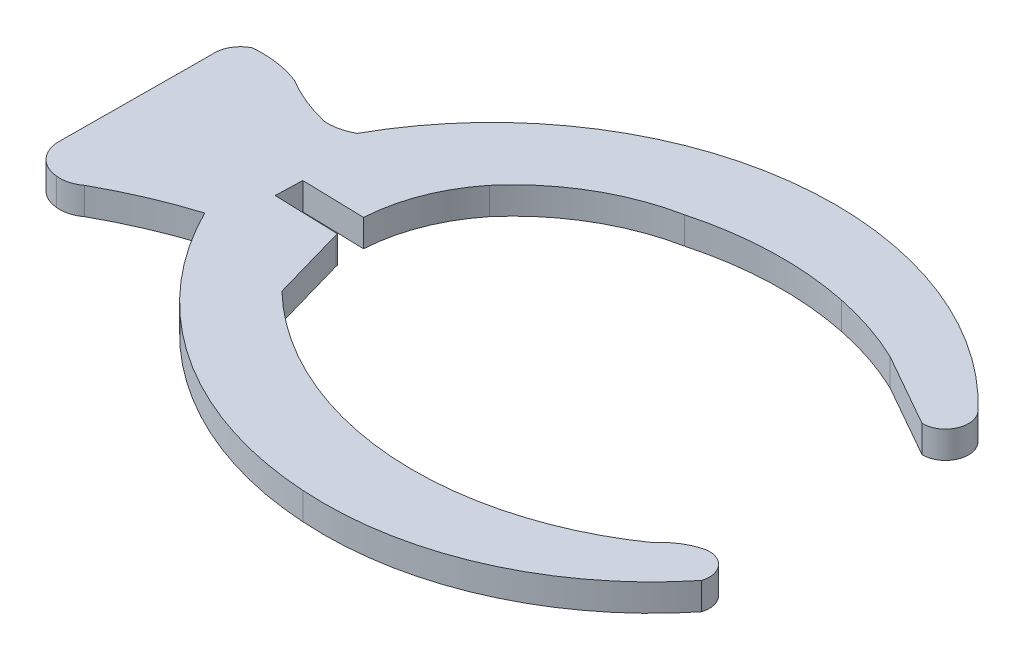
ISO-10303-21;
HEADER;
FILE_DESCRIPTION(('STEP AP214'),'2;1');
FILE_NAME('part.step','',(''),(''),'','','');
FILE_SCHEMA(('AUTOMOTIVE_DESIGN { 1 0 10303 214 1 1 1 1 }'));
ENDSEC;
DATA;
#1=APPLICATION_CONTEXT('core data for automotive mechanical design processes');
#2=APPLICATION_PROTOCOL_DEFINITION('international standard','automotive_design',2000,#1);
#3=PRODUCT_CONTEXT('',#1,'mechanical');
#4=PRODUCT('Part','Part','',(#3));
#5=PRODUCT_RELATED_PRODUCT_CATEGORY('part','',(#4));
#6=PRODUCT_DEFINITION_FORMATION('','',#4);
#7=PRODUCT_DEFINITION_CONTEXT('part definition',#1,'design');
#8=PRODUCT_DEFINITION('design','',#6,#7);
#9=PRODUCT_DEFINITION_SHAPE('','',#8);
#10=(LENGTH_UNIT() NAMED_UNIT(*) SI_UNIT(.MILLI.,.METRE.));
#11=(NAMED_UNIT(*) PLANE_ANGLE_UNIT() SI_UNIT($,.RADIAN.));
#12=(NAMED_UNIT(*) SI_UNIT($,.STERADIAN.) SOLID_ANGLE_UNIT());
#13=UNCERTAINTY_MEASURE_WITH_UNIT(LENGTH_MEASURE(1.E-05),#10,'distance_accuracy_value','');
#14=(GEOMETRIC_REPRESENTATION_CONTEXT(3) GLOBAL_UNCERTAINTY_ASSIGNED_CONTEXT((#13)) GLOBAL_UNIT_ASSIGNED_CONTEXT((#10,
#11,#12)) REPRESENTATION_CONTEXT('',''));
#15=CARTESIAN_POINT('',(0.,0.,0.));
#16=DIRECTION('',(0.,0.,1.));
#17=DIRECTION('',(1.,0.,0.));
#18=AXIS2_PLACEMENT_3D('',#15,#16,#17);
#19=CARTESIAN_POINT('',(93.208500000004,3.,82.9887600000175));
#20=DIRECTION('',(-0.998722727054454,0.,0.0505263739537519));
#21=DIRECTION('',(0.0505263739537519,0.,0.998722727054454));
#22=AXIS2_PLACEMENT_3D('',#19,#20,#21);
#23=PLANE('',#22);
#24=DIRECTION('',(-0.0505263739537519,0.,-0.998722727054454));
#25=VECTOR('',#24,1.);
#26=CARTESIAN_POINT('',(93.208500000004,0.,82.9887600000175));
#27=LINE('',#26,#25);
#28=CARTESIAN_POINT('',(93.208500000004,0.,82.9887600000175));
#29=VERTEX_POINT('',#28);
#30=CARTESIAN_POINT('',(93.198570000004,0.,82.7924800000175));
#31=VERTEX_POINT('',#30);
#32=EDGE_CURVE('E245',#29,#31,#27,.T.);
#33=ORIENTED_EDGE('',*,*,#32,.T.);
#34=DIRECTION('',(0.,-1.,0.));
#35=VECTOR('',#34,1.);
#36=CARTESIAN_POINT('',(93.198570000004,3.,82.7924800000175));
#37=LINE('',#36,#35);
#38=CARTESIAN_POINT('',(93.198570000004,3.,82.7924800000175));
#39=VERTEX_POINT('',#38);
#40=EDGE_CURVE('E11',#39,#31,#37,.T.);
#41=ORIENTED_EDGE('',*,*,#40,.F.);
#42=DIRECTION('',(-0.0505263739537519,0.,-0.998722727054454));
#43=VECTOR('',#42,1.);
#44=CARTESIAN_POINT('',(93.208500000004,3.,82.9887600000175));
#45=LINE('',#44,#43);
#46=CARTESIAN_POINT('',(93.208500000004,3.,82.9887600000175));
#47=VERTEX_POINT('',#46);
#48=EDGE_CURVE('E297',#47,#39,#45,.T.);
#49=ORIENTED_EDGE('',*,*,#48,.F.);
#50=DIRECTION('',(0.,-1.,0.));
#51=VECTOR('',#50,1.);
#52=CARTESIAN_POINT('',(93.208500000004,3.,82.9887600000175));
#53=LINE('',#52,#51);
#54=EDGE_CURVE('E241',#47,#29,#53,.T.);
#55=ORIENTED_EDGE('',*,*,#54,.T.);
#56=EDGE_LOOP('',(#33,#41,#49,#55));
#57=FACE_BOUND('',#56,.T.);
#58=ADVANCED_FACE('F35',(#57),#23,.F.);
#59=CARTESIAN_POINT('',(93.198570000004,3.,82.7924800000175));
#60=DIRECTION('',(-0.0312705869783198,0.,0.999510955612809));
#61=DIRECTION('',(0.999510955612809,0.,0.0312705869783198));
#62=AXIS2_PLACEMENT_3D('',#59,#60,#61);
#63=PLANE('',#62);
#64=DIRECTION('',(-0.999510955612809,0.,-0.0312705869783198));
#65=VECTOR('',#64,1.);
#66=CARTESIAN_POINT('',(93.198570000004,0.,82.7924800000175));
#67=LINE('',#66,#65);
#68=CARTESIAN_POINT('',(86.075550000004,0.,82.5696300000175));
#69=VERTEX_POINT('',#68);
#70=EDGE_CURVE('E248',#31,#69,#67,.T.);
#71=ORIENTED_EDGE('',*,*,#70,.T.);
#72=DIRECTION('',(0.,-1.,0.));
#73=VECTOR('',#72,1.);
#74=CARTESIAN_POINT('',(86.075550000004,3.,82.5696300000175));
#75=LINE('',#74,#73);
#76=CARTESIAN_POINT('',(86.075550000004,3.,82.5696300000175));
#77=VERTEX_POINT('',#76);
#78=EDGE_CURVE('E43',#77,#69,#75,.T.);
#79=ORIENTED_EDGE('',*,*,#78,.F.);
#80=DIRECTION('',(-0.999510955612809,0.,-0.0312705869783198));
#81=VECTOR('',#80,1.);
#82=CARTESIAN_POINT('',(93.198570000004,3.,82.7924800000175));
#83=LINE('',#82,#81);
#84=EDGE_CURVE('E151',#39,#77,#83,.T.);
#85=ORIENTED_EDGE('',*,*,#84,.F.);
#86=ORIENTED_EDGE('',*,*,#40,.T.);
#87=EDGE_LOOP('',(#71,#79,#85,#86));
#88=FACE_BOUND('',#87,.T.);
#89=ADVANCED_FACE('F450',(#88),#63,.F.);
#90=CARTESIAN_POINT('',(86.075550000004,3.,82.5696300000175));
#91=DIRECTION('',(-0.999593210603115,0.,-0.028520401753075));
#92=DIRECTION('',(-0.028520401753075,0.,0.999593210603115));
#93=AXIS2_PLACEMENT_3D('',#90,#91,#92);
#94=PLANE('',#93);
#95=DIRECTION('',(0.028520401753075,0.,-0.999593210603115));
#96=VECTOR('',#95,1.);
#97=CARTESIAN_POINT('',(86.075550000004,0.,82.5696300000175));
#98=LINE('',#97,#96);
#99=CARTESIAN_POINT('',(86.160130000004,0.,79.6052400000175));
#100=VERTEX_POINT('',#99);
#101=EDGE_CURVE('E250',#69,#100,#98,.T.);
#102=ORIENTED_EDGE('',*,*,#101,.T.);
#103=DIRECTION('',(0.,-1.,0.));
#104=VECTOR('',#103,1.);
#105=CARTESIAN_POINT('',(86.160130000004,3.,79.6052400000175));
#106=LINE('',#105,#104);
#107=CARTESIAN_POINT('',(86.160130000004,3.,79.6052400000175));
#108=VERTEX_POINT('',#107);
#109=EDGE_CURVE('E361',#108,#100,#106,.T.);
#110=ORIENTED_EDGE('',*,*,#109,.F.);
#111=DIRECTION('',(0.028520401753075,0.,-0.999593210603115));
#112=VECTOR('',#111,1.);
#113=CARTESIAN_POINT('',(86.075550000004,3.,82.5696300000175));
#114=LINE('',#113,#112);
#115=EDGE_CURVE('E369',#77,#108,#114,.T.);
#116=ORIENTED_EDGE('',*,*,#115,.F.);
#117=ORIENTED_EDGE('',*,*,#78,.T.);
#118=EDGE_LOOP('',(#102,#110,#116,#117));
#119=FACE_BOUND('',#118,.T.);
#120=ADVANCED_FACE('F367',(#119),#94,.F.);
#121=CARTESIAN_POINT('',(86.160130000004,3.,79.6052400000175));
#122=DIRECTION('',(0.0254375353754077,0.,-0.999676413542915));
#123=DIRECTION('',(-0.999676413542915,0.,-0.0254375353754077));
#124=AXIS2_PLACEMENT_3D('',#121,#122,#123);
#125=PLANE('',#124);
#126=DIRECTION('',(0.999676413542915,0.,0.0254375353754077));
#127=VECTOR('',#126,1.);
#128=CARTESIAN_POINT('',(86.160130000004,0.,79.6052400000175));
#129=LINE('',#128,#127);
#130=CARTESIAN_POINT('',(93.0465400000248,0.,79.7804700000575));
#131=VERTEX_POINT('',#130);
#132=EDGE_CURVE('E252',#100,#131,#129,.T.);
#133=ORIENTED_EDGE('',*,*,#132,.T.);
#134=DIRECTION('',(0.,-1.,0.));
#135=VECTOR('',#134,1.);
#136=CARTESIAN_POINT('',(93.0465400000248,3.,79.7804700000575));
#137=LINE('',#136,#135);
#138=CARTESIAN_POINT('',(93.0465400000248,3.,79.7804700000575));
#139=VERTEX_POINT('',#138);
#140=EDGE_CURVE('E358',#139,#131,#137,.T.);
#141=ORIENTED_EDGE('',*,*,#140,.F.);
#142=DIRECTION('',(0.999676413542915,0.,0.0254375353754077));
#143=VECTOR('',#142,1.);
#144=CARTESIAN_POINT('',(86.160130000004,3.,79.6052400000175));
#145=LINE('',#144,#143);
#146=EDGE_CURVE('E387',#108,#139,#145,.T.);
#147=ORIENTED_EDGE('',*,*,#146,.F.);
#148=ORIENTED_EDGE('',*,*,#109,.T.);
#149=EDGE_LOOP('',(#133,#141,#147,#148));
#150=FACE_BOUND('',#149,.T.);
#151=ADVANCED_FACE('F378',(#150),#125,.F.);
#152=CARTESIAN_POINT('',(110.573532174906,3.,80.8065943883846));
#153=DIRECTION('',(0.,-1.,0.));
#154=DIRECTION('',(0.,0.,-1.));
#155=AXIS2_PLACEMENT_3D('',#152,#153,#154);
#156=CYLINDRICAL_SURFACE('',#155,17.5570039004);
#157=CARTESIAN_POINT('',(110.573532174906,0.,80.8065943883846));
#158=DIRECTION('',(0.,-1.,0.));
#159=DIRECTION('',(0.,0.,1.));
#160=AXIS2_PLACEMENT_3D('',#157,#158,#159);
#161=CIRCLE('',#160,17.5570039004);
#162=CARTESIAN_POINT('',(96.9326800000336,0.,69.7532900000153));
#163=VERTEX_POINT('',#162);
#164=EDGE_CURVE('E254',#131,#163,#161,.T.);
#165=ORIENTED_EDGE('',*,*,#164,.T.);
#166=DIRECTION('',(0.,-1.,0.));
#167=VECTOR('',#166,1.);
#168=CARTESIAN_POINT('',(96.9326800000336,3.,69.7532900000153));
#169=LINE('',#168,#167);
#170=CARTESIAN_POINT('',(96.9326800000336,3.,69.7532900000153));
#171=VERTEX_POINT('',#170);
#172=EDGE_CURVE('E355',#171,#163,#169,.T.);
#173=ORIENTED_EDGE('',*,*,#172,.F.);
#174=CARTESIAN_POINT('',(110.573532174906,3.,80.8065943883846));
#175=DIRECTION('',(0.,-1.,0.));
#176=DIRECTION('',(0.,0.,1.));
#177=AXIS2_PLACEMENT_3D('',#174,#175,#176);
#178=CIRCLE('',#177,17.5570039004);
#179=EDGE_CURVE('E384',#139,#171,#178,.T.);
#180=ORIENTED_EDGE('',*,*,#179,.F.);
#181=ORIENTED_EDGE('',*,*,#140,.T.);
#182=EDGE_LOOP('',(#165,#173,#180,#181));
#183=FACE_BOUND('',#182,.T.);
#184=ADVANCED_FACE('F382',(#183),#156,.F.);
#185=CARTESIAN_POINT('',(115.175545866276,3.,85.3663165659496));
#186=DIRECTION('',(0.,-1.,0.));
#187=DIRECTION('',(0.,0.,-1.));
#188=AXIS2_PLACEMENT_3D('',#185,#186,#187);
#189=CYLINDRICAL_SURFACE('',#188,24.011846109);
#190=CARTESIAN_POINT('',(115.175545866276,0.,85.3663165659496));
#191=DIRECTION('',(0.,-1.,0.));
#192=DIRECTION('',(0.,0.,1.));
#193=AXIS2_PLACEMENT_3D('',#190,#191,#192);
#194=CIRCLE('',#193,24.011846109);
#195=CARTESIAN_POINT('',(110.492180000012,0.,61.8156300000551));
#196=VERTEX_POINT('',#195);
#197=EDGE_CURVE('E256',#163,#196,#194,.T.);
#198=ORIENTED_EDGE('',*,*,#197,.T.);
#199=DIRECTION('',(0.,-1.,0.));
#200=VECTOR('',#199,1.);
#201=CARTESIAN_POINT('',(110.492180000012,3.,61.8156300000551));
#202=LINE('',#201,#200);
#203=CARTESIAN_POINT('',(110.492180000012,3.,61.8156300000551));
#204=VERTEX_POINT('',#203);
#205=EDGE_CURVE('E352',#204,#196,#202,.T.);
#206=ORIENTED_EDGE('',*,*,#205,.F.);
#207=CARTESIAN_POINT('',(115.175545866276,3.,85.3663165659496));
#208=DIRECTION('',(0.,-1.,0.));
#209=DIRECTION('',(0.,0.,1.));
#210=AXIS2_PLACEMENT_3D('',#207,#208,#209);
#211=CIRCLE('',#210,24.011846109);
#212=EDGE_CURVE('E386',#171,#204,#211,.T.);
#213=ORIENTED_EDGE('',*,*,#212,.F.);
#214=ORIENTED_EDGE('',*,*,#172,.T.);
#215=EDGE_LOOP('',(#198,#206,#213,#214));
#216=FACE_BOUND('',#215,.T.);
#217=ADVANCED_FACE('F463',(#216),#189,.F.);
#218=CARTESIAN_POINT('',(119.980858659411,3.,96.7469606457883));
#219=DIRECTION('',(0.,-1.,0.));
#220=DIRECTION('',(0.,0.,-1.));
#221=AXIS2_PLACEMENT_3D('',#218,#219,#220);
#222=CYLINDRICAL_SURFACE('',#221,36.1971391602);
#223=CARTESIAN_POINT('',(119.980858659411,0.,96.7469606457883));
#224=DIRECTION('',(0.,-1.,0.));
#225=DIRECTION('',(0.,0.,1.));
#226=AXIS2_PLACEMENT_3D('',#223,#224,#225);
#227=CIRCLE('',#226,36.1971391602);
#228=CARTESIAN_POINT('',(127.340099999986,0.,61.3058200000069));
#229=VERTEX_POINT('',#228);
#230=EDGE_CURVE('E258',#196,#229,#227,.T.);
#231=ORIENTED_EDGE('',*,*,#230,.T.);
#232=DIRECTION('',(0.,-1.,0.));
#233=VECTOR('',#232,1.);
#234=CARTESIAN_POINT('',(127.340099999986,3.,61.3058200000069));
#235=LINE('',#234,#233);
#236=CARTESIAN_POINT('',(127.340099999986,3.,61.3058200000069));
#237=VERTEX_POINT('',#236);
#238=EDGE_CURVE('E349',#237,#229,#235,.T.);
#239=ORIENTED_EDGE('',*,*,#238,.F.);
#240=CARTESIAN_POINT('',(119.980858659411,3.,96.7469606457883));
#241=DIRECTION('',(0.,-1.,0.));
#242=DIRECTION('',(0.,0.,1.));
#243=AXIS2_PLACEMENT_3D('',#240,#241,#242);
#244=CIRCLE('',#243,36.1971391602);
#245=EDGE_CURVE('E389',#204,#237,#244,.T.);
#246=ORIENTED_EDGE('',*,*,#245,.F.);
#247=ORIENTED_EDGE('',*,*,#205,.T.);
#248=EDGE_LOOP('',(#231,#239,#246,#247));
#249=FACE_BOUND('',#248,.T.);
#250=ADVANCED_FACE('F466',(#249),#222,.F.);
#251=CARTESIAN_POINT('',(120.346254106704,3.,95.4322347436175));
#252=DIRECTION('',(0.,-1.,0.));
#253=DIRECTION('',(0.,0.,-1.));
#254=AXIS2_PLACEMENT_3D('',#251,#252,#253);
#255=CYLINDRICAL_SURFACE('',#254,34.8357009924);
#256=CARTESIAN_POINT('',(120.346254106704,0.,95.4322347436175));
#257=DIRECTION('',(0.,-1.,0.));
#258=DIRECTION('',(0.,0.,1.));
#259=AXIS2_PLACEMENT_3D('',#256,#257,#258);
#260=CIRCLE('',#259,34.8357009924);
#261=CARTESIAN_POINT('',(135.392759999974,0.,64.0136299999997));
#262=VERTEX_POINT('',#261);
#263=EDGE_CURVE('E260',#229,#262,#260,.T.);
#264=ORIENTED_EDGE('',*,*,#263,.T.);
#265=DIRECTION('',(0.,-1.,0.));
#266=VECTOR('',#265,1.);
#267=CARTESIAN_POINT('',(135.392759999974,3.,64.0136299999997));
#268=LINE('',#267,#266);
#269=CARTESIAN_POINT('',(135.392759999974,3.,64.0136299999997));
#270=VERTEX_POINT('',#269);
#271=EDGE_CURVE('E346',#270,#262,#268,.T.);
#272=ORIENTED_EDGE('',*,*,#271,.F.);
#273=CARTESIAN_POINT('',(120.346254106704,3.,95.4322347436175));
#274=DIRECTION('',(0.,-1.,0.));
#275=DIRECTION('',(0.,0.,1.));
#276=AXIS2_PLACEMENT_3D('',#273,#274,#275);
#277=CIRCLE('',#276,34.8357009924);
#278=EDGE_CURVE('E395',#237,#270,#277,.T.);
#279=ORIENTED_EDGE('',*,*,#278,.F.);
#280=ORIENTED_EDGE('',*,*,#238,.T.);
#281=EDGE_LOOP('',(#264,#272,#279,#280));
#282=FACE_BOUND('',#281,.T.);
#283=ADVANCED_FACE('F470',(#282),#255,.F.);
#284=CARTESIAN_POINT('',(135.392759999974,3.,64.0136299999997));
#285=DIRECTION('',(0.493060142037268,0.,-0.869995227765181));
#286=DIRECTION('',(-0.869995227765181,0.,-0.493060142037268));
#287=AXIS2_PLACEMENT_3D('',#284,#285,#286);
#288=PLANE('',#287);
#289=DIRECTION('',(0.869995227765181,0.,0.493060142037268));
#290=VECTOR('',#289,1.);
#291=CARTESIAN_POINT('',(135.392759999974,0.,64.0136299999997));
#292=LINE('',#291,#290);
#293=CARTESIAN_POINT('',(143.560260000004,0.,68.6424700000175));
#294=VERTEX_POINT('',#293);
#295=EDGE_CURVE('E262',#262,#294,#292,.T.);
#296=ORIENTED_EDGE('',*,*,#295,.T.);
#297=DIRECTION('',(0.,-1.,0.));
#298=VECTOR('',#297,1.);
#299=CARTESIAN_POINT('',(143.560260000004,3.,68.6424700000175));
#300=LINE('',#299,#298);
#301=CARTESIAN_POINT('',(143.560260000004,3.,68.6424700000175));
#302=VERTEX_POINT('',#301);
#303=EDGE_CURVE('E343',#302,#294,#300,.T.);
#304=ORIENTED_EDGE('',*,*,#303,.F.);
#305=DIRECTION('',(0.869995227765181,0.,0.493060142037268));
#306=VECTOR('',#305,1.);
#307=CARTESIAN_POINT('',(135.392759999974,3.,64.0136299999997));
#308=LINE('',#307,#306);
#309=EDGE_CURVE('E397',#270,#302,#308,.T.);
#310=ORIENTED_EDGE('',*,*,#309,.F.);
#311=ORIENTED_EDGE('',*,*,#271,.T.);
#312=EDGE_LOOP('',(#296,#304,#310,#311));
#313=FACE_BOUND('',#312,.T.);
#314=ADVANCED_FACE('F474',(#313),#288,.F.);
#315=CARTESIAN_POINT('',(143.611219668372,3.,66.1033107349826));
#316=DIRECTION('',(0.,-1.,0.));
#317=DIRECTION('',(0.,0.,-1.));
#318=AXIS2_PLACEMENT_3D('',#315,#316,#317);
#319=CYLINDRICAL_SURFACE('',#318,2.5396705812);
#320=CARTESIAN_POINT('',(143.611219668372,0.,66.1033107349826));
#321=DIRECTION('',(0.,1.,0.));
#322=DIRECTION('',(0.,0.,1.));
#323=AXIS2_PLACEMENT_3D('',#320,#321,#322);
#324=CIRCLE('',#323,2.5396705812);
#325=CARTESIAN_POINT('',(145.481290000065,0.,64.3849499999991));
#326=VERTEX_POINT('',#325);
#327=EDGE_CURVE('E264',#294,#326,#324,.T.);
#328=ORIENTED_EDGE('',*,*,#327,.T.);
#329=DIRECTION('',(0.,-1.,0.));
#330=VECTOR('',#329,1.);
#331=CARTESIAN_POINT('',(145.481290000065,3.,64.3849499999991));
#332=LINE('',#331,#330);
#333=CARTESIAN_POINT('',(145.481290000065,3.,64.3849499999991));
#334=VERTEX_POINT('',#333);
#335=EDGE_CURVE('E340',#334,#326,#332,.T.);
#336=ORIENTED_EDGE('',*,*,#335,.F.);
#337=CARTESIAN_POINT('',(143.611219668372,3.,66.1033107349826));
#338=DIRECTION('',(0.,1.,0.));
#339=DIRECTION('',(0.,0.,1.));
#340=AXIS2_PLACEMENT_3D('',#337,#338,#339);
#341=CIRCLE('',#340,2.5396705812);
#342=EDGE_CURVE('E399',#302,#334,#341,.T.);
#343=ORIENTED_EDGE('',*,*,#342,.F.);
#344=ORIENTED_EDGE('',*,*,#303,.T.);
#345=EDGE_LOOP('',(#328,#336,#343,#344));
#346=FACE_BOUND('',#345,.T.);
#347=ADVANCED_FACE('F478',(#346),#319,.T.);
#348=CARTESIAN_POINT('',(117.871385273109,3.,90.5769074207374));
#349=DIRECTION('',(0.,-1.,0.));
#350=DIRECTION('',(0.,0.,-1.));
#351=AXIS2_PLACEMENT_3D('',#348,#349,#350);
#352=CYLINDRICAL_SURFACE('',#351,38.0568715551);
#353=CARTESIAN_POINT('',(117.871385273109,0.,90.5769074207374));
#354=DIRECTION('',(0.,1.,0.));
#355=DIRECTION('',(0.,0.,1.));
#356=AXIS2_PLACEMENT_3D('',#353,#354,#355);
#357=CIRCLE('',#356,38.0568715551);
#358=CARTESIAN_POINT('',(124.956310000031,0.,53.1853400000578));
#359=VERTEX_POINT('',#358);
#360=EDGE_CURVE('E266',#326,#359,#357,.T.);
#361=ORIENTED_EDGE('',*,*,#360,.T.);
#362=DIRECTION('',(0.,-1.,0.));
#363=VECTOR('',#362,1.);
#364=CARTESIAN_POINT('',(124.956310000031,3.,53.1853400000578));
#365=LINE('',#364,#363);
#366=CARTESIAN_POINT('',(124.956310000031,3.,53.1853400000578));
#367=VERTEX_POINT('',#366);
#368=EDGE_CURVE('E337',#367,#359,#365,.T.);
#369=ORIENTED_EDGE('',*,*,#368,.F.);
#370=CARTESIAN_POINT('',(117.871385273109,3.,90.5769074207374));
#371=DIRECTION('',(0.,1.,0.));
#372=DIRECTION('',(0.,0.,1.));
#373=AXIS2_PLACEMENT_3D('',#370,#371,#372);
#374=CIRCLE('',#373,38.0568715551);
#375=EDGE_CURVE('E401',#334,#367,#374,.T.);
#376=ORIENTED_EDGE('',*,*,#375,.F.);
#377=ORIENTED_EDGE('',*,*,#335,.T.);
#378=EDGE_LOOP('',(#361,#369,#376,#377));
#379=FACE_BOUND('',#378,.T.);
#380=ADVANCED_FACE('F482',(#379),#352,.T.);
#381=CARTESIAN_POINT('',(117.841917036099,3.,90.4029313908265));
#382=DIRECTION('',(0.,-1.,0.));
#383=DIRECTION('',(0.,0.,-1.));
#384=AXIS2_PLACEMENT_3D('',#381,#382,#383);
#385=CYLINDRICAL_SURFACE('',#384,37.891472605);
#386=CARTESIAN_POINT('',(117.841917036099,0.,90.4029313908265));
#387=DIRECTION('',(0.,1.,0.));
#388=DIRECTION('',(0.,0.,1.));
#389=AXIS2_PLACEMENT_3D('',#386,#387,#388);
#390=CIRCLE('',#389,37.891472605);
#391=CARTESIAN_POINT('',(84.6696800000511,0.,72.0899200000225));
#392=VERTEX_POINT('',#391);
#393=EDGE_CURVE('E268',#359,#392,#390,.T.);
#394=ORIENTED_EDGE('',*,*,#393,.T.);
#395=DIRECTION('',(0.,-1.,0.));
#396=VECTOR('',#395,1.);
#397=CARTESIAN_POINT('',(84.6696800000511,3.,72.0899200000225));
#398=LINE('',#397,#396);
#399=CARTESIAN_POINT('',(84.6696800000511,3.,72.0899200000225));
#400=VERTEX_POINT('',#399);
#401=EDGE_CURVE('E334',#400,#392,#398,.T.);
#402=ORIENTED_EDGE('',*,*,#401,.F.);
#403=CARTESIAN_POINT('',(117.841917036099,3.,90.4029313908265));
#404=DIRECTION('',(0.,1.,0.));
#405=DIRECTION('',(0.,0.,1.));
#406=AXIS2_PLACEMENT_3D('',#403,#404,#405);
#407=CIRCLE('',#406,37.891472605);
#408=EDGE_CURVE('E403',#367,#400,#407,.T.);
#409=ORIENTED_EDGE('',*,*,#408,.F.);
#410=ORIENTED_EDGE('',*,*,#368,.T.);
#411=EDGE_LOOP('',(#394,#402,#409,#410));
#412=FACE_BOUND('',#411,.T.);
#413=ADVANCED_FACE('F486',(#412),#385,.T.);
#414=CARTESIAN_POINT('',(82.0758281452423,3.,67.5314681670849));
#415=DIRECTION('',(0.,-1.,0.));
#416=DIRECTION('',(0.,0.,-1.));
#417=AXIS2_PLACEMENT_3D('',#414,#415,#416);
#418=CYLINDRICAL_SURFACE('',#417,5.24476410889062);
#419=CARTESIAN_POINT('',(82.0758281452423,0.,67.5314681670849));
#420=DIRECTION('',(0.,-1.,0.));
#421=DIRECTION('',(0.,0.,1.));
#422=AXIS2_PLACEMENT_3D('',#419,#420,#421);
#423=CIRCLE('',#422,5.24476410889062);
#424=CARTESIAN_POINT('',(81.6847299999996,0.,72.7616300000204));
#425=VERTEX_POINT('',#424);
#426=EDGE_CURVE('E270',#392,#425,#423,.T.);
#427=ORIENTED_EDGE('',*,*,#426,.T.);
#428=DIRECTION('',(0.,-1.,0.));
#429=VECTOR('',#428,1.);
#430=CARTESIAN_POINT('',(81.6847299999996,3.,72.7616300000204));
#431=LINE('',#430,#429);
#432=CARTESIAN_POINT('',(81.6847299999996,3.,72.7616300000204));
#433=VERTEX_POINT('',#432);
#434=EDGE_CURVE('E331',#433,#425,#431,.T.);
#435=ORIENTED_EDGE('',*,*,#434,.F.);
#436=CARTESIAN_POINT('',(82.0758281452423,3.,67.5314681670849));
#437=DIRECTION('',(0.,-1.,0.));
#438=DIRECTION('',(0.,0.,1.));
#439=AXIS2_PLACEMENT_3D('',#436,#437,#438);
#440=CIRCLE('',#439,5.24476410889062);
#441=EDGE_CURVE('E405',#400,#433,#440,.T.);
#442=ORIENTED_EDGE('',*,*,#441,.F.);
#443=ORIENTED_EDGE('',*,*,#401,.T.);
#444=EDGE_LOOP('',(#427,#435,#442,#443));
#445=FACE_BOUND('',#444,.T.);
#446=ADVANCED_FACE('F490',(#445),#418,.F.);
#447=CARTESIAN_POINT('',(86.2531700917,3.,53.6104359448));
#448=DIRECTION('',(0.,-1.,0.));
#449=DIRECTION('',(0.,0.,-1.));
#450=AXIS2_PLACEMENT_3D('',#447,#448,#449);
#451=CYLINDRICAL_SURFACE('',#450,19.6885468893);
#452=CARTESIAN_POINT('',(86.2531700917,0.,53.6104359448));
#453=DIRECTION('',(0.,-1.,0.));
#454=DIRECTION('',(0.,0.,1.));
#455=AXIS2_PLACEMENT_3D('',#452,#453,#454);
#456=CIRCLE('',#455,19.6885468893);
#457=CARTESIAN_POINT('',(76.0837099999857,0.,70.4692900000196));
#458=VERTEX_POINT('',#457);
#459=EDGE_CURVE('E272',#425,#458,#456,.T.);
#460=ORIENTED_EDGE('',*,*,#459,.T.);
#461=DIRECTION('',(0.,-1.,0.));
#462=VECTOR('',#461,1.);
#463=CARTESIAN_POINT('',(76.0837099999857,3.,70.4692900000196));
#464=LINE('',#463,#462);
#465=CARTESIAN_POINT('',(76.0837099999857,3.,70.4692900000196));
#466=VERTEX_POINT('',#465);
#467=EDGE_CURVE('E328',#466,#458,#464,.T.);
#468=ORIENTED_EDGE('',*,*,#467,.F.);
#469=CARTESIAN_POINT('',(86.2531700917,3.,53.6104359448));
#470=DIRECTION('',(0.,-1.,0.));
#471=DIRECTION('',(0.,0.,1.));
#472=AXIS2_PLACEMENT_3D('',#469,#470,#471);
#473=CIRCLE('',#472,19.6885468893);
#474=EDGE_CURVE('E407',#433,#466,#473,.T.);
#475=ORIENTED_EDGE('',*,*,#474,.F.);
#476=ORIENTED_EDGE('',*,*,#434,.T.);
#477=EDGE_LOOP('',(#460,#468,#475,#476));
#478=FACE_BOUND('',#477,.T.);
#479=ADVANCED_FACE('F494',(#478),#451,.F.);
#480=CARTESIAN_POINT('',(71.7424550385774,3.,81.711849297802));
#481=DIRECTION('',(0.,-1.,0.));
#482=DIRECTION('',(0.,0.,-1.));
#483=AXIS2_PLACEMENT_3D('',#480,#481,#482);
#484=CYLINDRICAL_SURFACE('',#483,12.0516237165);
#485=CARTESIAN_POINT('',(71.7424550385774,0.,81.711849297802));
#486=DIRECTION('',(0.,1.,0.));
#487=DIRECTION('',(0.,0.,1.));
#488=AXIS2_PLACEMENT_3D('',#485,#486,#487);
#489=CIRCLE('',#488,12.0516237165);
#490=CARTESIAN_POINT('',(70.6915799999873,0.,69.70613000001));
#491=VERTEX_POINT('',#490);
#492=EDGE_CURVE('E274',#458,#491,#489,.T.);
#493=ORIENTED_EDGE('',*,*,#492,.T.);
#494=DIRECTION('',(0.,-1.,0.));
#495=VECTOR('',#494,1.);
#496=CARTESIAN_POINT('',(70.6915799999873,3.,69.70613000001));
#497=LINE('',#496,#495);
#498=CARTESIAN_POINT('',(70.6915799999873,3.,69.70613000001));
#499=VERTEX_POINT('',#498);
#500=EDGE_CURVE('E325',#499,#491,#497,.T.);
#501=ORIENTED_EDGE('',*,*,#500,.F.);
#502=CARTESIAN_POINT('',(71.7424550385774,3.,81.711849297802));
#503=DIRECTION('',(0.,1.,0.));
#504=DIRECTION('',(0.,0.,1.));
#505=AXIS2_PLACEMENT_3D('',#502,#503,#504);
#506=CIRCLE('',#505,12.0516237165);
#507=EDGE_CURVE('E409',#466,#499,#506,.T.);
#508=ORIENTED_EDGE('',*,*,#507,.F.);
#509=ORIENTED_EDGE('',*,*,#467,.T.);
#510=EDGE_LOOP('',(#493,#501,#508,#509));
#511=FACE_BOUND('',#510,.T.);
#512=ADVANCED_FACE('F498',(#511),#484,.T.);
#513=CARTESIAN_POINT('',(71.9897471791076,3.,72.3123551529713));
#514=DIRECTION('',(0.,-1.,0.));
#515=DIRECTION('',(0.,0.,-1.));
#516=AXIS2_PLACEMENT_3D('',#513,#514,#515);
#517=CYLINDRICAL_SURFACE('',#516,2.91164001429999);
#518=CARTESIAN_POINT('',(71.9897471791076,0.,72.3123551529713));
#519=DIRECTION('',(0.,1.,0.));
#520=DIRECTION('',(0.,0.,1.));
#521=AXIS2_PLACEMENT_3D('',#518,#519,#520);
#522=CIRCLE('',#521,2.91164001429999);
#523=CARTESIAN_POINT('',(69.0947399999533,0.,72.6231299999549));
#524=VERTEX_POINT('',#523);
#525=EDGE_CURVE('E276',#491,#524,#522,.T.);
#526=ORIENTED_EDGE('',*,*,#525,.T.);
#527=DIRECTION('',(0.,-1.,0.));
#528=VECTOR('',#527,1.);
#529=CARTESIAN_POINT('',(69.0947399999533,3.,72.6231299999549));
#530=LINE('',#529,#528);
#531=CARTESIAN_POINT('',(69.0947399999533,3.,72.6231299999549));
#532=VERTEX_POINT('',#531);
#533=EDGE_CURVE('E322',#532,#524,#530,.T.);
#534=ORIENTED_EDGE('',*,*,#533,.F.);
#535=CARTESIAN_POINT('',(71.9897471791076,3.,72.3123551529713));
#536=DIRECTION('',(0.,1.,0.));
#537=DIRECTION('',(0.,0.,1.));
#538=AXIS2_PLACEMENT_3D('',#535,#536,#537);
#539=CIRCLE('',#538,2.91164001429999);
#540=EDGE_CURVE('E411',#499,#532,#539,.T.);
#541=ORIENTED_EDGE('',*,*,#540,.F.);
#542=ORIENTED_EDGE('',*,*,#500,.T.);
#543=EDGE_LOOP('',(#526,#534,#541,#542));
#544=FACE_BOUND('',#543,.T.);
#545=ADVANCED_FACE('F502',(#544),#517,.T.);
#546=CARTESIAN_POINT('',(69.0947399999533,3.,72.6231299999549));
#547=DIRECTION('',(0.999976111438527,0.,0.00691205846929404));
#548=DIRECTION('',(0.00691205846929404,0.,-0.999976111438527));
#549=AXIS2_PLACEMENT_3D('',#546,#547,#548);
#550=PLANE('',#549);
#551=DIRECTION('',(-0.00691205846929404,0.,0.999976111438527));
#552=VECTOR('',#551,1.);
#553=CARTESIAN_POINT('',(69.0947399999533,0.,72.6231299999549));
#554=LINE('',#553,#552);
#555=CARTESIAN_POINT('',(68.97973,0.,89.26177));
#556=VERTEX_POINT('',#555);
#557=EDGE_CURVE('E278',#524,#556,#554,.T.);
#558=ORIENTED_EDGE('',*,*,#557,.T.);
#559=DIRECTION('',(0.,-1.,0.));
#560=VECTOR('',#559,1.);
#561=CARTESIAN_POINT('',(68.97973,3.,89.26177));
#562=LINE('',#561,#560);
#563=CARTESIAN_POINT('',(68.97973,3.,89.26177));
#564=VERTEX_POINT('',#563);
#565=EDGE_CURVE('E319',#564,#556,#562,.T.);
#566=ORIENTED_EDGE('',*,*,#565,.F.);
#567=DIRECTION('',(-0.00691205846929404,0.,0.999976111438527));
#568=VECTOR('',#567,1.);
#569=CARTESIAN_POINT('',(69.0947399999533,3.,72.6231299999549));
#570=LINE('',#569,#568);
#571=EDGE_CURVE('E413',#532,#564,#570,.T.);
#572=ORIENTED_EDGE('',*,*,#571,.F.);
#573=ORIENTED_EDGE('',*,*,#533,.T.);
#574=EDGE_LOOP('',(#558,#566,#572,#573));
#575=FACE_BOUND('',#574,.T.);
#576=ADVANCED_FACE('F506',(#575),#550,.F.);
#577=CARTESIAN_POINT('',(72.4252658404894,3.,89.3433553537991));
#578=DIRECTION('',(0.,-1.,0.));
#579=DIRECTION('',(0.,0.,-1.));
#580=AXIS2_PLACEMENT_3D('',#577,#578,#579);
#581=CYLINDRICAL_SURFACE('',#580,3.4465016173);
#582=CARTESIAN_POINT('',(72.4252658404894,0.,89.3433553537991));
#583=DIRECTION('',(0.,1.,0.));
#584=DIRECTION('',(0.,0.,1.));
#585=AXIS2_PLACEMENT_3D('',#582,#583,#584);
#586=CIRCLE('',#585,3.4465016173);
#587=CARTESIAN_POINT('',(72.1265799999771,0.,92.7768900000098));
#588=VERTEX_POINT('',#587);
#589=EDGE_CURVE('E280',#556,#588,#586,.T.);
#590=ORIENTED_EDGE('',*,*,#589,.T.);
#591=DIRECTION('',(0.,-1.,0.));
#592=VECTOR('',#591,1.);
#593=CARTESIAN_POINT('',(72.1265799999771,3.,92.7768900000098));
#594=LINE('',#593,#592);
#595=CARTESIAN_POINT('',(72.1265799999771,3.,92.7768900000098));
#596=VERTEX_POINT('',#595);
#597=EDGE_CURVE('E316',#596,#588,#594,.T.);
#598=ORIENTED_EDGE('',*,*,#597,.F.);
#599=CARTESIAN_POINT('',(72.4252658404894,3.,89.3433553537991));
#600=DIRECTION('',(0.,1.,0.));
#601=DIRECTION('',(0.,0.,1.));
#602=AXIS2_PLACEMENT_3D('',#599,#600,#601);
#603=CIRCLE('',#602,3.4465016173);
#604=EDGE_CURVE('E415',#564,#596,#603,.T.);
#605=ORIENTED_EDGE('',*,*,#604,.F.);
#606=ORIENTED_EDGE('',*,*,#565,.T.);
#607=EDGE_LOOP('',(#590,#598,#605,#606));
#608=FACE_BOUND('',#607,.T.);
#609=ADVANCED_FACE('F510',(#608),#581,.T.);
#610=CARTESIAN_POINT('',(72.5450451788522,3.,89.474771313737));
#611=DIRECTION('',(0.,-1.,0.));
#612=DIRECTION('',(0.,0.,-1.));
#613=AXIS2_PLACEMENT_3D('',#610,#611,#612);
#614=CYLINDRICAL_SURFACE('',#613,3.3285283421);
#615=CARTESIAN_POINT('',(72.5450451788522,0.,89.474771313737));
#616=DIRECTION('',(0.,1.,0.));
#617=DIRECTION('',(0.,0.,1.));
#618=AXIS2_PLACEMENT_3D('',#615,#616,#617);
#619=CIRCLE('',#618,3.3285283421);
#620=CARTESIAN_POINT('',(74.5809199999587,0.,92.1080799999619));
#621=VERTEX_POINT('',#620);
#622=EDGE_CURVE('E282',#588,#621,#619,.T.);
#623=ORIENTED_EDGE('',*,*,#622,.T.);
#624=DIRECTION('',(0.,-1.,0.));
#625=VECTOR('',#624,1.);
#626=CARTESIAN_POINT('',(74.5809199999587,3.,92.1080799999619));
#627=LINE('',#626,#625);
#628=CARTESIAN_POINT('',(74.5809199999587,3.,92.1080799999619));
#629=VERTEX_POINT('',#628);
#630=EDGE_CURVE('E313',#629,#621,#627,.T.);
#631=ORIENTED_EDGE('',*,*,#630,.F.);
#632=CARTESIAN_POINT('',(72.5450451788522,3.,89.474771313737));
#633=DIRECTION('',(0.,1.,0.));
#634=DIRECTION('',(0.,0.,1.));
#635=AXIS2_PLACEMENT_3D('',#632,#633,#634);
#636=CIRCLE('',#635,3.3285283421);
#637=EDGE_CURVE('E417',#596,#629,#636,.T.);
#638=ORIENTED_EDGE('',*,*,#637,.F.);
#639=ORIENTED_EDGE('',*,*,#597,.T.);
#640=EDGE_LOOP('',(#623,#631,#638,#639));
#641=FACE_BOUND('',#640,.T.);
#642=ADVANCED_FACE('F514',(#641),#614,.T.);
#643=CARTESIAN_POINT('',(98.9636239246697,3.,136.136982606445));
#644=DIRECTION('',(0.,-1.,0.));
#645=DIRECTION('',(0.,0.,-1.));
#646=AXIS2_PLACEMENT_3D('',#643,#644,#645);
#647=CYLINDRICAL_SURFACE('',#646,50.3295193242626);
#648=CARTESIAN_POINT('',(98.9636239246697,0.,136.136982606445));
#649=DIRECTION('',(0.,-1.,0.));
#650=DIRECTION('',(0.,0.,1.));
#651=AXIS2_PLACEMENT_3D('',#648,#649,#650);
#652=CIRCLE('',#651,50.3295193242626);
#653=CARTESIAN_POINT('',(83.859240000002,0.,88.1274199999441));
#654=VERTEX_POINT('',#653);
#655=EDGE_CURVE('E284',#621,#654,#652,.T.);
#656=ORIENTED_EDGE('',*,*,#655,.T.);
#657=DIRECTION('',(0.,-1.,0.));
#658=VECTOR('',#657,1.);
#659=CARTESIAN_POINT('',(83.859240000002,3.,88.1274199999441));
#660=LINE('',#659,#658);
#661=CARTESIAN_POINT('',(83.859240000002,3.,88.1274199999441));
#662=VERTEX_POINT('',#661);
#663=EDGE_CURVE('E310',#662,#654,#660,.T.);
#664=ORIENTED_EDGE('',*,*,#663,.F.);
#665=CARTESIAN_POINT('',(98.9636239246697,3.,136.136982606445));
#666=DIRECTION('',(0.,-1.,0.));
#667=DIRECTION('',(0.,0.,1.));
#668=AXIS2_PLACEMENT_3D('',#665,#666,#667);
#669=CIRCLE('',#668,50.3295193242626);
#670=EDGE_CURVE('E419',#629,#662,#669,.T.);
#671=ORIENTED_EDGE('',*,*,#670,.F.);
#672=ORIENTED_EDGE('',*,*,#630,.T.);
#673=EDGE_LOOP('',(#656,#664,#671,#672));
#674=FACE_BOUND('',#673,.T.);
#675=ADVANCED_FACE('F518',(#674),#647,.F.);
#676=CARTESIAN_POINT('',(118.122257401328,3.,70.9892448872903));
#677=DIRECTION('',(0.,-1.,0.));
#678=DIRECTION('',(0.,0.,-1.));
#679=AXIS2_PLACEMENT_3D('',#676,#677,#678);
#680=CYLINDRICAL_SURFACE('',#679,38.3101997859);
#681=CARTESIAN_POINT('',(118.122257401328,0.,70.9892448872903));
#682=DIRECTION('',(0.,1.,0.));
#683=DIRECTION('',(0.,0.,1.));
#684=AXIS2_PLACEMENT_3D('',#681,#682,#683);
#685=CIRCLE('',#684,38.3101997859);
#686=CARTESIAN_POINT('',(115.816599999889,0.,109.229999999902));
#687=VERTEX_POINT('',#686);
#688=EDGE_CURVE('E286',#654,#687,#685,.T.);
#689=ORIENTED_EDGE('',*,*,#688,.T.);
#690=DIRECTION('',(0.,-1.,0.));
#691=VECTOR('',#690,1.);
#692=CARTESIAN_POINT('',(115.816599999889,3.,109.229999999902));
#693=LINE('',#692,#691);
#694=CARTESIAN_POINT('',(115.816599999889,3.,109.229999999902));
#695=VERTEX_POINT('',#694);
#696=EDGE_CURVE('E307',#695,#687,#693,.T.);
#697=ORIENTED_EDGE('',*,*,#696,.F.);
#698=CARTESIAN_POINT('',(118.122257401328,3.,70.9892448872903));
#699=DIRECTION('',(0.,1.,0.));
#700=DIRECTION('',(0.,0.,1.));
#701=AXIS2_PLACEMENT_3D('',#698,#699,#700);
#702=CIRCLE('',#701,38.3101997859);
#703=EDGE_CURVE('E421',#662,#695,#702,.T.);
#704=ORIENTED_EDGE('',*,*,#703,.F.);
#705=ORIENTED_EDGE('',*,*,#663,.T.);
#706=EDGE_LOOP('',(#689,#697,#704,#705));
#707=FACE_BOUND('',#706,.T.);
#708=ADVANCED_FACE('F522',(#707),#680,.T.);
#709=CARTESIAN_POINT('',(118.249250444121,3.,73.1633498054226));
#710=DIRECTION('',(0.,-1.,0.));
#711=DIRECTION('',(0.,0.,-1.));
#712=AXIS2_PLACEMENT_3D('',#709,#710,#711);
#713=CYLINDRICAL_SURFACE('',#712,36.1485967146);
#714=CARTESIAN_POINT('',(118.249250444121,0.,73.1633498054226));
#715=DIRECTION('',(0.,1.,0.));
#716=DIRECTION('',(0.,0.,1.));
#717=AXIS2_PLACEMENT_3D('',#714,#715,#716);
#718=CIRCLE('',#717,36.1485967146);
#719=CARTESIAN_POINT('',(146.406579999964,0.,95.8323999998715));
#720=VERTEX_POINT('',#719);
#721=EDGE_CURVE('E288',#687,#720,#718,.T.);
#722=ORIENTED_EDGE('',*,*,#721,.T.);
#723=DIRECTION('',(0.,-1.,0.));
#724=VECTOR('',#723,1.);
#725=CARTESIAN_POINT('',(146.406579999964,3.,95.8323999998715));
#726=LINE('',#725,#724);
#727=CARTESIAN_POINT('',(146.406579999964,3.,95.8323999998715));
#728=VERTEX_POINT('',#727);
#729=EDGE_CURVE('E304',#728,#720,#726,.T.);
#730=ORIENTED_EDGE('',*,*,#729,.F.);
#731=CARTESIAN_POINT('',(118.249250444121,3.,73.1633498054226));
#732=DIRECTION('',(0.,1.,0.));
#733=DIRECTION('',(0.,0.,1.));
#734=AXIS2_PLACEMENT_3D('',#731,#732,#733);
#735=CIRCLE('',#734,36.1485967146);
#736=EDGE_CURVE('E423',#695,#728,#735,.T.);
#737=ORIENTED_EDGE('',*,*,#736,.F.);
#738=ORIENTED_EDGE('',*,*,#696,.T.);
#739=EDGE_LOOP('',(#722,#730,#737,#738));
#740=FACE_BOUND('',#739,.T.);
#741=ADVANCED_FACE('F526',(#740),#713,.T.);
#742=CARTESIAN_POINT('',(144.062780553501,3.,95.0840606762801));
#743=DIRECTION('',(0.,-1.,0.));
#744=DIRECTION('',(0.,0.,-1.));
#745=AXIS2_PLACEMENT_3D('',#742,#743,#744);
#746=CYLINDRICAL_SURFACE('',#745,2.46036736860011);
#747=CARTESIAN_POINT('',(144.062780553501,0.,95.0840606762801));
#748=DIRECTION('',(0.,1.,0.));
#749=DIRECTION('',(0.,0.,1.));
#750=AXIS2_PLACEMENT_3D('',#747,#748,#749);
#751=CIRCLE('',#750,2.46036736860011);
#752=CARTESIAN_POINT('',(143.793079999946,0.,92.6385199998888));
#753=VERTEX_POINT('',#752);
#754=EDGE_CURVE('E290',#720,#753,#751,.T.);
#755=ORIENTED_EDGE('',*,*,#754,.T.);
#756=DIRECTION('',(0.,-1.,0.));
#757=VECTOR('',#756,1.);
#758=CARTESIAN_POINT('',(143.793079999946,3.,92.6385199998888));
#759=LINE('',#758,#757);
#760=CARTESIAN_POINT('',(143.793079999946,3.,92.6385199998888));
#761=VERTEX_POINT('',#760);
#762=EDGE_CURVE('E301',#761,#753,#759,.T.);
#763=ORIENTED_EDGE('',*,*,#762,.F.);
#764=CARTESIAN_POINT('',(144.062780553501,3.,95.0840606762801));
#765=DIRECTION('',(0.,1.,0.));
#766=DIRECTION('',(0.,0.,1.));
#767=AXIS2_PLACEMENT_3D('',#764,#765,#766);
#768=CIRCLE('',#767,2.46036736860011);
#769=EDGE_CURVE('E425',#728,#761,#768,.T.);
#770=ORIENTED_EDGE('',*,*,#769,.F.);
#771=ORIENTED_EDGE('',*,*,#729,.T.);
#772=EDGE_LOOP('',(#755,#763,#770,#771));
#773=FACE_BOUND('',#772,.T.);
#774=ADVANCED_FACE('F431',(#773),#746,.T.);
#775=CARTESIAN_POINT('',(145.214020178013,3.,99.052963750702));
#776=DIRECTION('',(0.,-1.,0.));
#777=DIRECTION('',(0.,0.,-1.));
#778=AXIS2_PLACEMENT_3D('',#775,#776,#777);
#779=CYLINDRICAL_SURFACE('',#778,6.5699436544);
#780=CARTESIAN_POINT('',(145.214020178013,0.,99.052963750702));
#781=DIRECTION('',(0.,1.,0.));
#782=DIRECTION('',(0.,0.,1.));
#783=AXIS2_PLACEMENT_3D('',#780,#781,#782);
#784=CIRCLE('',#783,6.5699436544);
#785=CARTESIAN_POINT('',(140.136579999981,0.,94.883580000015));
#786=VERTEX_POINT('',#785);
#787=EDGE_CURVE('E292',#753,#786,#784,.T.);
#788=ORIENTED_EDGE('',*,*,#787,.T.);
#789=DIRECTION('',(0.,-1.,0.));
#790=VECTOR('',#789,1.);
#791=CARTESIAN_POINT('',(140.136579999981,3.,94.883580000015));
#792=LINE('',#791,#790);
#793=CARTESIAN_POINT('',(140.136579999981,3.,94.883580000015));
#794=VERTEX_POINT('',#793);
#795=EDGE_CURVE('E236',#794,#786,#792,.T.);
#796=ORIENTED_EDGE('',*,*,#795,.F.);
#797=CARTESIAN_POINT('',(145.214020178013,3.,99.052963750702));
#798=DIRECTION('',(0.,1.,0.));
#799=DIRECTION('',(0.,0.,1.));
#800=AXIS2_PLACEMENT_3D('',#797,#798,#799);
#801=CIRCLE('',#800,6.5699436544);
#802=EDGE_CURVE('E227',#761,#794,#801,.T.);
#803=ORIENTED_EDGE('',*,*,#802,.F.);
#804=ORIENTED_EDGE('',*,*,#762,.T.);
#805=EDGE_LOOP('',(#788,#796,#803,#804));
#806=FACE_BOUND('',#805,.T.);
#807=ADVANCED_FACE('F435',(#806),#779,.T.);
#808=CARTESIAN_POINT('',(120.208510328675,3.,66.397724898674));
#809=DIRECTION('',(0.,-1.,0.));
#810=DIRECTION('',(0.,0.,-1.));
#811=AXIS2_PLACEMENT_3D('',#808,#809,#810);
#812=CYLINDRICAL_SURFACE('',#811,34.7645207313292);
#813=CARTESIAN_POINT('',(120.208510328675,0.,66.397724898674));
#814=DIRECTION('',(0.,-1.,0.));
#815=DIRECTION('',(0.,0.,1.));
#816=AXIS2_PLACEMENT_3D('',#813,#814,#815);
#817=CIRCLE('',#816,34.7645207313292);
#818=CARTESIAN_POINT('',(130.716760000016,0.,99.5360500000393));
#819=VERTEX_POINT('',#818);
#820=EDGE_CURVE('E235',#786,#819,#817,.T.);
#821=ORIENTED_EDGE('',*,*,#820,.T.);
#822=DIRECTION('',(0.,-1.,0.));
#823=VECTOR('',#822,1.);
#824=CARTESIAN_POINT('',(130.716760000016,3.,99.5360500000393));
#825=LINE('',#824,#823);
#826=CARTESIAN_POINT('',(130.716760000016,3.,99.5360500000393));
#827=VERTEX_POINT('',#826);
#828=EDGE_CURVE('E232',#827,#819,#825,.T.);
#829=ORIENTED_EDGE('',*,*,#828,.F.);
#830=CARTESIAN_POINT('',(120.208510328675,3.,66.397724898674));
#831=DIRECTION('',(0.,-1.,0.));
#832=DIRECTION('',(0.,0.,1.));
#833=AXIS2_PLACEMENT_3D('',#830,#831,#832);
#834=CIRCLE('',#833,34.7645207313292);
#835=EDGE_CURVE('E221',#794,#827,#834,.T.);
#836=ORIENTED_EDGE('',*,*,#835,.F.);
#837=ORIENTED_EDGE('',*,*,#795,.T.);
#838=EDGE_LOOP('',(#821,#829,#836,#837));
#839=FACE_BOUND('',#838,.T.);
#840=ADVANCED_FACE('F233',(#839),#812,.F.);
#841=CARTESIAN_POINT('',(119.990168236404,3.,66.1369195886175));
#842=DIRECTION('',(0.,-1.,0.));
#843=DIRECTION('',(0.,0.,-1.));
#844=AXIS2_PLACEMENT_3D('',#841,#842,#843);
#845=CYLINDRICAL_SURFACE('',#844,35.0793626382);
#846=CARTESIAN_POINT('',(119.990168236404,0.,66.1369195886175));
#847=DIRECTION('',(0.,-1.,0.));
#848=DIRECTION('',(0.,0.,1.));
#849=AXIS2_PLACEMENT_3D('',#846,#847,#848);
#850=CIRCLE('',#849,35.0793626382);
#851=CARTESIAN_POINT('',(95.5920200000419,0.,91.3419200000208));
#852=VERTEX_POINT('',#851);
#853=EDGE_CURVE('E137',#819,#852,#850,.T.);
#854=ORIENTED_EDGE('',*,*,#853,.T.);
#855=DIRECTION('',(0.,-1.,0.));
#856=VECTOR('',#855,1.);
#857=CARTESIAN_POINT('',(95.5920200000419,3.,91.3419200000208));
#858=LINE('',#857,#856);
#859=CARTESIAN_POINT('',(95.5920200000419,3.,91.3419200000208));
#860=VERTEX_POINT('',#859);
#861=EDGE_CURVE('E237',#860,#852,#858,.T.);
#862=ORIENTED_EDGE('',*,*,#861,.F.);
#863=CARTESIAN_POINT('',(119.990168236404,3.,66.1369195886175));
#864=DIRECTION('',(0.,-1.,0.));
#865=DIRECTION('',(0.,0.,1.));
#866=AXIS2_PLACEMENT_3D('',#863,#864,#865);
#867=CIRCLE('',#866,35.0793626382);
#868=EDGE_CURVE('E225',#827,#860,#867,.T.);
#869=ORIENTED_EDGE('',*,*,#868,.F.);
#870=ORIENTED_EDGE('',*,*,#828,.T.);
#871=EDGE_LOOP('',(#854,#862,#869,#870));
#872=FACE_BOUND('',#871,.T.);
#873=ADVANCED_FACE('F239',(#872),#845,.F.);
#874=CARTESIAN_POINT('',(95.5920200000419,3.,91.3419200000208));
#875=DIRECTION('',(-0.961618072553124,0.,0.274391476797686));
#876=DIRECTION('',(0.274391476797686,0.,0.961618072553124));
#877=AXIS2_PLACEMENT_3D('',#874,#875,#876);
#878=PLANE('',#877);
#879=DIRECTION('',(-0.274391476797686,0.,-0.961618072553124));
#880=VECTOR('',#879,1.);
#881=CARTESIAN_POINT('',(95.5920200000419,0.,91.3419200000208));
#882=LINE('',#881,#880);
#883=EDGE_CURVE('E143',#852,#29,#882,.T.);
#884=ORIENTED_EDGE('',*,*,#883,.T.);
#885=ORIENTED_EDGE('',*,*,#54,.F.);
#886=DIRECTION('',(-0.274391476797686,0.,-0.961618072553124));
#887=VECTOR('',#886,1.);
#888=CARTESIAN_POINT('',(95.5920200000419,3.,91.3419200000208));
#889=LINE('',#888,#887);
#890=EDGE_CURVE('E51',#860,#47,#889,.T.);
#891=ORIENTED_EDGE('',*,*,#890,.F.);
#892=ORIENTED_EDGE('',*,*,#861,.T.);
#893=EDGE_LOOP('',(#884,#885,#891,#892));
#894=FACE_BOUND('',#893,.T.);
#895=ADVANCED_FACE('F439',(#894),#878,.F.);
#896=CARTESIAN_POINT('',(110.573532174906,3.,80.8065943883846));
#897=DIRECTION('',(0.,1.,0.));
#898=DIRECTION('',(0.,0.,1.));
#899=AXIS2_PLACEMENT_3D('',#896,#897,#898);
#900=PLANE('',#899);
#901=ORIENTED_EDGE('',*,*,#48,.T.);
#902=ORIENTED_EDGE('',*,*,#84,.T.);
#903=ORIENTED_EDGE('',*,*,#115,.T.);
#904=ORIENTED_EDGE('',*,*,#146,.T.);
#905=ORIENTED_EDGE('',*,*,#179,.T.);
#906=ORIENTED_EDGE('',*,*,#212,.T.);
#907=ORIENTED_EDGE('',*,*,#245,.T.);
#908=ORIENTED_EDGE('',*,*,#278,.T.);
#909=ORIENTED_EDGE('',*,*,#309,.T.);
#910=ORIENTED_EDGE('',*,*,#342,.T.);
#911=ORIENTED_EDGE('',*,*,#375,.T.);
#912=ORIENTED_EDGE('',*,*,#408,.T.);
#913=ORIENTED_EDGE('',*,*,#441,.T.);
#914=ORIENTED_EDGE('',*,*,#474,.T.);
#915=ORIENTED_EDGE('',*,*,#507,.T.);
#916=ORIENTED_EDGE('',*,*,#540,.T.);
#917=ORIENTED_EDGE('',*,*,#571,.T.);
#918=ORIENTED_EDGE('',*,*,#604,.T.);
#919=ORIENTED_EDGE('',*,*,#637,.T.);
#920=ORIENTED_EDGE('',*,*,#670,.T.);
#921=ORIENTED_EDGE('',*,*,#703,.T.);
#922=ORIENTED_EDGE('',*,*,#736,.T.);
#923=ORIENTED_EDGE('',*,*,#769,.T.);
#924=ORIENTED_EDGE('',*,*,#802,.T.);
#925=ORIENTED_EDGE('',*,*,#835,.T.);
#926=ORIENTED_EDGE('',*,*,#868,.T.);
#927=ORIENTED_EDGE('',*,*,#890,.T.);
#928=EDGE_LOOP('',(#901,#902,#903,#904,#905,#906,#907,#908,#909,#910,#911,#912,#913,#914,#915,
#916,#917,#918,#919,#920,#921,#922,#923,#924,#925,#926,#927));
#929=FACE_BOUND('',#928,.T.);
#930=ADVANCED_FACE('F223',(#929),#900,.T.);
#931=CARTESIAN_POINT('',(110.573532174906,0.,80.8065943883846));
#932=DIRECTION('',(0.,1.,0.));
#933=DIRECTION('',(0.,0.,1.));
#934=AXIS2_PLACEMENT_3D('',#931,#932,#933);
#935=PLANE('',#934);
#936=ORIENTED_EDGE('',*,*,#32,.F.);
#937=ORIENTED_EDGE('',*,*,#883,.F.);
#938=ORIENTED_EDGE('',*,*,#853,.F.);
#939=ORIENTED_EDGE('',*,*,#820,.F.);
#940=ORIENTED_EDGE('',*,*,#787,.F.);
#941=ORIENTED_EDGE('',*,*,#754,.F.);
#942=ORIENTED_EDGE('',*,*,#721,.F.);
#943=ORIENTED_EDGE('',*,*,#688,.F.);
#944=ORIENTED_EDGE('',*,*,#655,.F.);
#945=ORIENTED_EDGE('',*,*,#622,.F.);
#946=ORIENTED_EDGE('',*,*,#589,.F.);
#947=ORIENTED_EDGE('',*,*,#557,.F.);
#948=ORIENTED_EDGE('',*,*,#525,.F.);
#949=ORIENTED_EDGE('',*,*,#492,.F.);
#950=ORIENTED_EDGE('',*,*,#459,.F.);
#951=ORIENTED_EDGE('',*,*,#426,.F.);
#952=ORIENTED_EDGE('',*,*,#393,.F.);
#953=ORIENTED_EDGE('',*,*,#360,.F.);
#954=ORIENTED_EDGE('',*,*,#327,.F.);
#955=ORIENTED_EDGE('',*,*,#295,.F.);
#956=ORIENTED_EDGE('',*,*,#263,.F.);
#957=ORIENTED_EDGE('',*,*,#230,.F.);
#958=ORIENTED_EDGE('',*,*,#197,.F.);
#959=ORIENTED_EDGE('',*,*,#164,.F.);
#960=ORIENTED_EDGE('',*,*,#132,.F.);
#961=ORIENTED_EDGE('',*,*,#101,.F.);
#962=ORIENTED_EDGE('',*,*,#70,.F.);
#963=EDGE_LOOP('',(#936,#937,#938,#939,#940,#941,#942,#943,#944,#945,#946,#947,#948,#949,#950,
#951,#952,#953,#954,#955,#956,#957,#958,#959,#960,#961,#962));
#964=FACE_BOUND('',#963,.T.);
#965=ADVANCED_FACE('F373',(#964),#935,.F.);
#966=CLOSED_SHELL('',(#58,#89,#120,#151,#184,#217,#250,#283,#314,#347,#380,#413,#446,#479,#512,
#545,#576,#609,#642,#675,#708,#741,#774,#807,#840,#873,#895,#930,#965));
#967=MANIFOLD_SOLID_BREP('B2',#966);
#968=ADVANCED_BREP_SHAPE_REPRESENTATION('',(#18,#967),#14);
#969=SHAPE_DEFINITION_REPRESENTATION(#9,#968);
ENDSEC;
END-ISO-10303-21;
